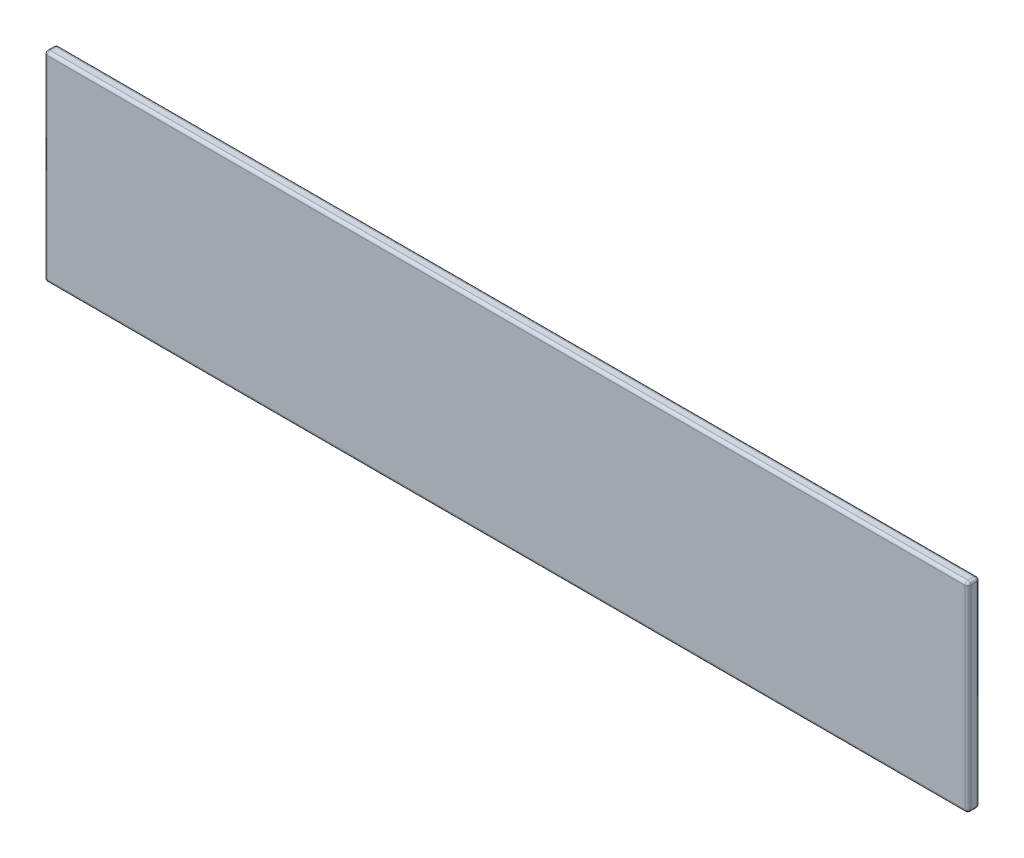
ISO-10303-21;
HEADER;
FILE_DESCRIPTION(('STEP AP214'),'2;1');
FILE_NAME('part.step','',(''),(''),'','','');
FILE_SCHEMA(('AUTOMOTIVE_DESIGN { 1 0 10303 214 1 1 1 1 }'));
ENDSEC;
DATA;
#1=APPLICATION_CONTEXT('core data for automotive mechanical design processes');
#2=APPLICATION_PROTOCOL_DEFINITION('international standard','automotive_design',2000,#1);
#3=PRODUCT_CONTEXT('',#1,'mechanical');
#4=PRODUCT('Part','Part','',(#3));
#5=PRODUCT_RELATED_PRODUCT_CATEGORY('part','',(#4));
#6=PRODUCT_DEFINITION_FORMATION('','',#4);
#7=PRODUCT_DEFINITION_CONTEXT('part definition',#1,'design');
#8=PRODUCT_DEFINITION('design','',#6,#7);
#9=PRODUCT_DEFINITION_SHAPE('','',#8);
#10=(LENGTH_UNIT() NAMED_UNIT(*) SI_UNIT(.MILLI.,.METRE.));
#11=(NAMED_UNIT(*) PLANE_ANGLE_UNIT() SI_UNIT($,.RADIAN.));
#12=(NAMED_UNIT(*) SI_UNIT($,.STERADIAN.) SOLID_ANGLE_UNIT());
#13=UNCERTAINTY_MEASURE_WITH_UNIT(LENGTH_MEASURE(1.E-05),#10,'distance_accuracy_value','');
#14=(GEOMETRIC_REPRESENTATION_CONTEXT(3) GLOBAL_UNCERTAINTY_ASSIGNED_CONTEXT((#13)) GLOBAL_UNIT_ASSIGNED_CONTEXT((#10,
#11,#12)) REPRESENTATION_CONTEXT('',''));
#15=CARTESIAN_POINT('',(0.,0.,0.));
#16=DIRECTION('',(0.,0.,1.));
#17=DIRECTION('',(1.,0.,0.));
#18=AXIS2_PLACEMENT_3D('',#15,#16,#17);
#19=CARTESIAN_POINT('',(77.35,-16.75,2.));
#20=DIRECTION('',(-1.,0.,0.));
#21=DIRECTION('',(0.,0.,1.));
#22=AXIS2_PLACEMENT_3D('',#19,#20,#21);
#23=PLANE('',#22);
#24=DIRECTION('',(0.,1.,0.));
#25=VECTOR('',#24,1.);
#26=CARTESIAN_POINT('',(77.35,-16.75,1.5));
#27=LINE('',#26,#25);
#28=CARTESIAN_POINT('',(77.35,16.25,1.5));
#29=VERTEX_POINT('',#28);
#30=CARTESIAN_POINT('',(77.35,-16.25,1.5));
#31=VERTEX_POINT('',#30);
#32=EDGE_CURVE('E42',#29,#31,#27,.F.);
#33=ORIENTED_EDGE('',*,*,#32,.T.);
#34=DIRECTION('',(0.,0.,-1.));
#35=VECTOR('',#34,1.);
#36=CARTESIAN_POINT('',(77.35,-16.25,2.));
#37=LINE('',#36,#35);
#38=CARTESIAN_POINT('',(77.35,-16.25,0.5));
#39=VERTEX_POINT('',#38);
#40=EDGE_CURVE('E11',#31,#39,#37,.T.);
#41=ORIENTED_EDGE('',*,*,#40,.T.);
#42=DIRECTION('',(0.,1.,0.));
#43=VECTOR('',#42,1.);
#44=CARTESIAN_POINT('',(77.35,16.75,0.5));
#45=LINE('',#44,#43);
#46=CARTESIAN_POINT('',(77.35,16.25,0.5));
#47=VERTEX_POINT('',#46);
#48=EDGE_CURVE('E194',#39,#47,#45,.T.);
#49=ORIENTED_EDGE('',*,*,#48,.T.);
#50=DIRECTION('',(0.,0.,-1.));
#51=VECTOR('',#50,1.);
#52=CARTESIAN_POINT('',(77.35,16.25,2.));
#53=LINE('',#52,#51);
#54=EDGE_CURVE('E53',#47,#29,#53,.F.);
#55=ORIENTED_EDGE('',*,*,#54,.T.);
#56=EDGE_LOOP('',(#33,#41,#49,#55));
#57=FACE_BOUND('',#56,.T.);
#58=ADVANCED_FACE('F33',(#57),#23,.F.);
#59=CARTESIAN_POINT('',(-77.35,16.75,2.));
#60=DIRECTION('',(0.,-1.,0.));
#61=DIRECTION('',(0.,0.,-1.));
#62=AXIS2_PLACEMENT_3D('',#59,#60,#61);
#63=PLANE('',#62);
#64=DIRECTION('',(0.,0.,-1.));
#65=VECTOR('',#64,1.);
#66=CARTESIAN_POINT('',(-76.85,16.75,2.));
#67=LINE('',#66,#65);
#68=CARTESIAN_POINT('',(-76.85,16.75,0.5));
#69=VERTEX_POINT('',#68);
#70=CARTESIAN_POINT('',(-76.85,16.75,1.5));
#71=VERTEX_POINT('',#70);
#72=EDGE_CURVE('E189',#69,#71,#67,.F.);
#73=ORIENTED_EDGE('',*,*,#72,.T.);
#74=DIRECTION('',(-1.,0.,0.));
#75=VECTOR('',#74,1.);
#76=CARTESIAN_POINT('',(-77.35,16.75,1.5));
#77=LINE('',#76,#75);
#78=CARTESIAN_POINT('',(76.85,16.75,1.5));
#79=VERTEX_POINT('',#78);
#80=EDGE_CURVE('E191',#71,#79,#77,.F.);
#81=ORIENTED_EDGE('',*,*,#80,.T.);
#82=DIRECTION('',(0.,0.,-1.));
#83=VECTOR('',#82,1.);
#84=CARTESIAN_POINT('',(76.85,16.75,2.));
#85=LINE('',#84,#83);
#86=CARTESIAN_POINT('',(76.85,16.75,0.5));
#87=VERTEX_POINT('',#86);
#88=EDGE_CURVE('E185',#79,#87,#85,.T.);
#89=ORIENTED_EDGE('',*,*,#88,.T.);
#90=DIRECTION('',(-1.,0.,0.));
#91=VECTOR('',#90,1.);
#92=CARTESIAN_POINT('',(-77.35,16.75,0.5));
#93=LINE('',#92,#91);
#94=EDGE_CURVE('E187',#87,#69,#93,.T.);
#95=ORIENTED_EDGE('',*,*,#94,.T.);
#96=EDGE_LOOP('',(#73,#81,#89,#95));
#97=FACE_BOUND('',#96,.T.);
#98=ADVANCED_FACE('F278',(#97),#63,.F.);
#99=CARTESIAN_POINT('',(-77.35,-16.75,2.));
#100=DIRECTION('',(1.,0.,0.));
#101=DIRECTION('',(0.,0.,-1.));
#102=AXIS2_PLACEMENT_3D('',#99,#100,#101);
#103=PLANE('',#102);
#104=DIRECTION('',(0.,0.,-1.));
#105=VECTOR('',#104,1.);
#106=CARTESIAN_POINT('',(-77.35,-16.25,2.));
#107=LINE('',#106,#105);
#108=CARTESIAN_POINT('',(-77.35,-16.25,0.5));
#109=VERTEX_POINT('',#108);
#110=CARTESIAN_POINT('',(-77.35,-16.25,1.5));
#111=VERTEX_POINT('',#110);
#112=EDGE_CURVE('E180',#109,#111,#107,.F.);
#113=ORIENTED_EDGE('',*,*,#112,.T.);
#114=DIRECTION('',(0.,-1.,0.));
#115=VECTOR('',#114,1.);
#116=CARTESIAN_POINT('',(-77.35,-16.75,1.5));
#117=LINE('',#116,#115);
#118=CARTESIAN_POINT('',(-77.35,16.25,1.5));
#119=VERTEX_POINT('',#118);
#120=EDGE_CURVE('E182',#111,#119,#117,.F.);
#121=ORIENTED_EDGE('',*,*,#120,.T.);
#122=DIRECTION('',(0.,0.,-1.));
#123=VECTOR('',#122,1.);
#124=CARTESIAN_POINT('',(-77.35,16.25,2.));
#125=LINE('',#124,#123);
#126=CARTESIAN_POINT('',(-77.35,16.25,0.5));
#127=VERTEX_POINT('',#126);
#128=EDGE_CURVE('E176',#119,#127,#125,.T.);
#129=ORIENTED_EDGE('',*,*,#128,.T.);
#130=DIRECTION('',(0.,-1.,0.));
#131=VECTOR('',#130,1.);
#132=CARTESIAN_POINT('',(-77.35,-16.75,0.5));
#133=LINE('',#132,#131);
#134=EDGE_CURVE('E178',#127,#109,#133,.T.);
#135=ORIENTED_EDGE('',*,*,#134,.T.);
#136=EDGE_LOOP('',(#113,#121,#129,#135));
#137=FACE_BOUND('',#136,.T.);
#138=ADVANCED_FACE('F269',(#137),#103,.F.);
#139=CARTESIAN_POINT('',(-77.35,-16.75,2.));
#140=DIRECTION('',(0.,1.,0.));
#141=DIRECTION('',(0.,0.,1.));
#142=AXIS2_PLACEMENT_3D('',#139,#140,#141);
#143=PLANE('',#142);
#144=DIRECTION('',(1.,0.,0.));
#145=VECTOR('',#144,1.);
#146=CARTESIAN_POINT('',(-77.35,-16.75,1.5));
#147=LINE('',#146,#145);
#148=CARTESIAN_POINT('',(76.85,-16.75,1.5));
#149=VERTEX_POINT('',#148);
#150=CARTESIAN_POINT('',(-76.85,-16.75,1.5));
#151=VERTEX_POINT('',#150);
#152=EDGE_CURVE('E129',#149,#151,#147,.F.);
#153=ORIENTED_EDGE('',*,*,#152,.T.);
#154=DIRECTION('',(0.,0.,-1.));
#155=VECTOR('',#154,1.);
#156=CARTESIAN_POINT('',(-76.85,-16.75,2.));
#157=LINE('',#156,#155);
#158=CARTESIAN_POINT('',(-76.85,-16.75,0.5));
#159=VERTEX_POINT('',#158);
#160=EDGE_CURVE('E165',#151,#159,#157,.T.);
#161=ORIENTED_EDGE('',*,*,#160,.T.);
#162=DIRECTION('',(1.,0.,0.));
#163=VECTOR('',#162,1.);
#164=CARTESIAN_POINT('',(77.35,-16.75,0.5));
#165=LINE('',#164,#163);
#166=CARTESIAN_POINT('',(76.85,-16.75,0.5));
#167=VERTEX_POINT('',#166);
#168=EDGE_CURVE('E158',#159,#167,#165,.T.);
#169=ORIENTED_EDGE('',*,*,#168,.T.);
#170=DIRECTION('',(0.,0.,-1.));
#171=VECTOR('',#170,1.);
#172=CARTESIAN_POINT('',(76.85,-16.75,2.));
#173=LINE('',#172,#171);
#174=EDGE_CURVE('E156',#167,#149,#173,.F.);
#175=ORIENTED_EDGE('',*,*,#174,.T.);
#176=EDGE_LOOP('',(#153,#161,#169,#175));
#177=FACE_BOUND('',#176,.T.);
#178=ADVANCED_FACE('F356',(#177),#143,.F.);
#179=CARTESIAN_POINT('',(0.,0.,2.));
#180=DIRECTION('',(0.,0.,-1.));
#181=DIRECTION('',(-1.,0.,0.));
#182=AXIS2_PLACEMENT_3D('',#179,#180,#181);
#183=PLANE('',#182);
#184=DIRECTION('',(0.,-1.,0.));
#185=VECTOR('',#184,1.);
#186=CARTESIAN_POINT('',(-76.85,0.,2.));
#187=LINE('',#186,#185);
#188=CARTESIAN_POINT('',(-76.85,16.25,2.));
#189=VERTEX_POINT('',#188);
#190=CARTESIAN_POINT('',(-76.85,-16.25,2.));
#191=VERTEX_POINT('',#190);
#192=EDGE_CURVE('E154',#189,#191,#187,.T.);
#193=ORIENTED_EDGE('',*,*,#192,.T.);
#194=DIRECTION('',(1.,0.,0.));
#195=VECTOR('',#194,1.);
#196=CARTESIAN_POINT('',(0.,-16.25,2.));
#197=LINE('',#196,#195);
#198=CARTESIAN_POINT('',(76.85,-16.25,2.));
#199=VERTEX_POINT('',#198);
#200=EDGE_CURVE('E127',#191,#199,#197,.T.);
#201=ORIENTED_EDGE('',*,*,#200,.T.);
#202=DIRECTION('',(0.,1.,0.));
#203=VECTOR('',#202,1.);
#204=CARTESIAN_POINT('',(76.85,0.,2.));
#205=LINE('',#204,#203);
#206=CARTESIAN_POINT('',(76.85,16.25,2.));
#207=VERTEX_POINT('',#206);
#208=EDGE_CURVE('E144',#199,#207,#205,.T.);
#209=ORIENTED_EDGE('',*,*,#208,.T.);
#210=DIRECTION('',(-1.,0.,0.));
#211=VECTOR('',#210,1.);
#212=CARTESIAN_POINT('',(0.,16.25,2.));
#213=LINE('',#212,#211);
#214=EDGE_CURVE('E150',#207,#189,#213,.T.);
#215=ORIENTED_EDGE('',*,*,#214,.T.);
#216=EDGE_LOOP('',(#193,#201,#209,#215));
#217=FACE_BOUND('',#216,.T.);
#218=ADVANCED_FACE('F152',(#217),#183,.F.);
#219=CARTESIAN_POINT('',(0.,0.,0.));
#220=DIRECTION('',(0.,0.,-1.));
#221=DIRECTION('',(-1.,0.,0.));
#222=AXIS2_PLACEMENT_3D('',#219,#220,#221);
#223=PLANE('',#222);
#224=DIRECTION('',(0.,1.,0.));
#225=VECTOR('',#224,1.);
#226=CARTESIAN_POINT('',(76.85,-16.75,0.));
#227=LINE('',#226,#225);
#228=CARTESIAN_POINT('',(76.85,16.25,0.));
#229=VERTEX_POINT('',#228);
#230=CARTESIAN_POINT('',(76.85,-16.25,0.));
#231=VERTEX_POINT('',#230);
#232=EDGE_CURVE('E167',#229,#231,#227,.F.);
#233=ORIENTED_EDGE('',*,*,#232,.T.);
#234=DIRECTION('',(1.,0.,0.));
#235=VECTOR('',#234,1.);
#236=CARTESIAN_POINT('',(-77.35,-16.25,0.));
#237=LINE('',#236,#235);
#238=CARTESIAN_POINT('',(-76.85,-16.25,0.));
#239=VERTEX_POINT('',#238);
#240=EDGE_CURVE('E173',#231,#239,#237,.F.);
#241=ORIENTED_EDGE('',*,*,#240,.T.);
#242=DIRECTION('',(0.,-1.,0.));
#243=VECTOR('',#242,1.);
#244=CARTESIAN_POINT('',(-76.85,16.75,0.));
#245=LINE('',#244,#243);
#246=CARTESIAN_POINT('',(-76.85,16.25,0.));
#247=VERTEX_POINT('',#246);
#248=EDGE_CURVE('E171',#239,#247,#245,.F.);
#249=ORIENTED_EDGE('',*,*,#248,.T.);
#250=DIRECTION('',(-1.,0.,0.));
#251=VECTOR('',#250,1.);
#252=CARTESIAN_POINT('',(77.35,16.25,0.));
#253=LINE('',#252,#251);
#254=EDGE_CURVE('E169',#247,#229,#253,.F.);
#255=ORIENTED_EDGE('',*,*,#254,.T.);
#256=EDGE_LOOP('',(#233,#241,#249,#255));
#257=FACE_BOUND('',#256,.T.);
#258=ADVANCED_FACE('F296',(#257),#223,.T.);
#259=CARTESIAN_POINT('',(-77.35,16.25,0.5));
#260=DIRECTION('',(1.,0.,0.));
#261=DIRECTION('',(0.,0.,-1.));
#262=AXIS2_PLACEMENT_3D('',#259,#260,#261);
#263=CYLINDRICAL_SURFACE('',#262,0.5);
#264=CARTESIAN_POINT('',(-76.85,16.25,0.5));
#265=DIRECTION('',(-1.,0.,0.));
#266=DIRECTION('',(0.,0.,1.));
#267=AXIS2_PLACEMENT_3D('',#264,#265,#266);
#268=CIRCLE('',#267,0.5);
#269=EDGE_CURVE('E37',#69,#247,#268,.T.);
#270=ORIENTED_EDGE('',*,*,#269,.F.);
#271=ORIENTED_EDGE('',*,*,#94,.F.);
#272=CARTESIAN_POINT('',(76.85,16.25,0.5));
#273=DIRECTION('',(1.,0.,0.));
#274=DIRECTION('',(0.,0.,-1.));
#275=AXIS2_PLACEMENT_3D('',#272,#273,#274);
#276=CIRCLE('',#275,0.5);
#277=EDGE_CURVE('E246',#229,#87,#276,.T.);
#278=ORIENTED_EDGE('',*,*,#277,.F.);
#279=ORIENTED_EDGE('',*,*,#254,.F.);
#280=EDGE_LOOP('',(#270,#271,#278,#279));
#281=FACE_BOUND('',#280,.T.);
#282=ADVANCED_FACE('F35',(#281),#263,.T.);
#283=CARTESIAN_POINT('',(-76.85,16.25,0.5));
#284=DIRECTION('',(0.,0.,1.));
#285=DIRECTION('',(1.,0.,0.));
#286=AXIS2_PLACEMENT_3D('',#283,#284,#285);
#287=SPHERICAL_SURFACE('',#286,0.5);
#288=CARTESIAN_POINT('',(-76.85,16.25,0.5));
#289=DIRECTION('',(0.,0.,-1.));
#290=DIRECTION('',(-1.,0.,0.));
#291=AXIS2_PLACEMENT_3D('',#288,#289,#290);
#292=CIRCLE('',#291,0.5);
#293=EDGE_CURVE('E241',#69,#127,#292,.F.);
#294=ORIENTED_EDGE('',*,*,#293,.F.);
#295=ORIENTED_EDGE('',*,*,#269,.T.);
#296=CARTESIAN_POINT('',(-76.85,16.25,0.5));
#297=DIRECTION('',(0.,1.,0.));
#298=DIRECTION('',(0.,0.,1.));
#299=AXIS2_PLACEMENT_3D('',#296,#297,#298);
#300=CIRCLE('',#299,0.5);
#301=EDGE_CURVE('E244',#127,#247,#300,.F.);
#302=ORIENTED_EDGE('',*,*,#301,.F.);
#303=EDGE_LOOP('',(#294,#295,#302));
#304=FACE_BOUND('',#303,.T.);
#305=ADVANCED_FACE('F257',(#304),#287,.T.);
#306=CARTESIAN_POINT('',(76.85,16.25,0.5));
#307=DIRECTION('',(0.,0.,1.));
#308=DIRECTION('',(1.,0.,0.));
#309=AXIS2_PLACEMENT_3D('',#306,#307,#308);
#310=SPHERICAL_SURFACE('',#309,0.5);
#311=CARTESIAN_POINT('',(76.85,16.25,0.5));
#312=DIRECTION('',(0.,1.,0.));
#313=DIRECTION('',(0.,0.,1.));
#314=AXIS2_PLACEMENT_3D('',#311,#312,#313);
#315=CIRCLE('',#314,0.5);
#316=EDGE_CURVE('E235',#229,#47,#315,.F.);
#317=ORIENTED_EDGE('',*,*,#316,.F.);
#318=ORIENTED_EDGE('',*,*,#277,.T.);
#319=CARTESIAN_POINT('',(76.85,16.25,0.5));
#320=DIRECTION('',(0.,0.,-1.));
#321=DIRECTION('',(-1.,0.,0.));
#322=AXIS2_PLACEMENT_3D('',#319,#320,#321);
#323=CIRCLE('',#322,0.5);
#324=EDGE_CURVE('E238',#47,#87,#323,.F.);
#325=ORIENTED_EDGE('',*,*,#324,.F.);
#326=EDGE_LOOP('',(#317,#318,#325));
#327=FACE_BOUND('',#326,.T.);
#328=ADVANCED_FACE('F289',(#327),#310,.T.);
#329=CARTESIAN_POINT('',(-76.85,-16.75,0.5));
#330=DIRECTION('',(0.,1.,0.));
#331=DIRECTION('',(0.,0.,1.));
#332=AXIS2_PLACEMENT_3D('',#329,#330,#331);
#333=CYLINDRICAL_SURFACE('',#332,0.5);
#334=ORIENTED_EDGE('',*,*,#301,.T.);
#335=ORIENTED_EDGE('',*,*,#248,.F.);
#336=CARTESIAN_POINT('',(-76.85,-16.25,0.5));
#337=DIRECTION('',(0.,-1.,0.));
#338=DIRECTION('',(0.,0.,-1.));
#339=AXIS2_PLACEMENT_3D('',#336,#337,#338);
#340=CIRCLE('',#339,0.5);
#341=EDGE_CURVE('E230',#109,#239,#340,.T.);
#342=ORIENTED_EDGE('',*,*,#341,.F.);
#343=ORIENTED_EDGE('',*,*,#134,.F.);
#344=EDGE_LOOP('',(#334,#335,#342,#343));
#345=FACE_BOUND('',#344,.T.);
#346=ADVANCED_FACE('F265',(#345),#333,.T.);
#347=CARTESIAN_POINT('',(-76.85,16.25,2.));
#348=DIRECTION('',(0.,0.,-1.));
#349=DIRECTION('',(-1.,0.,0.));
#350=AXIS2_PLACEMENT_3D('',#347,#348,#349);
#351=CYLINDRICAL_SURFACE('',#350,0.5);
#352=ORIENTED_EDGE('',*,*,#293,.T.);
#353=ORIENTED_EDGE('',*,*,#128,.F.);
#354=CARTESIAN_POINT('',(-76.85,16.25,1.5));
#355=DIRECTION('',(0.,0.,1.));
#356=DIRECTION('',(1.,0.,0.));
#357=AXIS2_PLACEMENT_3D('',#354,#355,#356);
#358=CIRCLE('',#357,0.5);
#359=EDGE_CURVE('E227',#71,#119,#358,.T.);
#360=ORIENTED_EDGE('',*,*,#359,.F.);
#361=ORIENTED_EDGE('',*,*,#72,.F.);
#362=EDGE_LOOP('',(#352,#353,#360,#361));
#363=FACE_BOUND('',#362,.T.);
#364=ADVANCED_FACE('F275',(#363),#351,.T.);
#365=CARTESIAN_POINT('',(0.,16.25,1.5));
#366=DIRECTION('',(-1.,0.,0.));
#367=DIRECTION('',(0.,0.,1.));
#368=AXIS2_PLACEMENT_3D('',#365,#366,#367);
#369=CYLINDRICAL_SURFACE('',#368,0.5);
#370=CARTESIAN_POINT('',(76.85,16.25,1.5));
#371=DIRECTION('',(1.,0.,0.));
#372=DIRECTION('',(0.,0.,-1.));
#373=AXIS2_PLACEMENT_3D('',#370,#371,#372);
#374=CIRCLE('',#373,0.5);
#375=EDGE_CURVE('E221',#79,#207,#374,.T.);
#376=ORIENTED_EDGE('',*,*,#375,.F.);
#377=ORIENTED_EDGE('',*,*,#80,.F.);
#378=CARTESIAN_POINT('',(-76.85,16.25,1.5));
#379=DIRECTION('',(-1.,0.,0.));
#380=DIRECTION('',(0.,0.,1.));
#381=AXIS2_PLACEMENT_3D('',#378,#379,#380);
#382=CIRCLE('',#381,0.5);
#383=EDGE_CURVE('E224',#189,#71,#382,.T.);
#384=ORIENTED_EDGE('',*,*,#383,.F.);
#385=ORIENTED_EDGE('',*,*,#214,.F.);
#386=EDGE_LOOP('',(#376,#377,#384,#385));
#387=FACE_BOUND('',#386,.T.);
#388=ADVANCED_FACE('F282',(#387),#369,.T.);
#389=CARTESIAN_POINT('',(76.85,16.25,2.));
#390=DIRECTION('',(0.,0.,-1.));
#391=DIRECTION('',(-1.,0.,0.));
#392=AXIS2_PLACEMENT_3D('',#389,#390,#391);
#393=CYLINDRICAL_SURFACE('',#392,0.5);
#394=ORIENTED_EDGE('',*,*,#324,.T.);
#395=ORIENTED_EDGE('',*,*,#88,.F.);
#396=CARTESIAN_POINT('',(76.85,16.25,1.5));
#397=DIRECTION('',(0.,0.,1.));
#398=DIRECTION('',(1.,0.,0.));
#399=AXIS2_PLACEMENT_3D('',#396,#397,#398);
#400=CIRCLE('',#399,0.5);
#401=EDGE_CURVE('E219',#29,#79,#400,.T.);
#402=ORIENTED_EDGE('',*,*,#401,.F.);
#403=ORIENTED_EDGE('',*,*,#54,.F.);
#404=EDGE_LOOP('',(#394,#395,#402,#403));
#405=FACE_BOUND('',#404,.T.);
#406=ADVANCED_FACE('F287',(#405),#393,.T.);
#407=CARTESIAN_POINT('',(76.85,-16.75,0.5));
#408=DIRECTION('',(0.,-1.,0.));
#409=DIRECTION('',(0.,0.,-1.));
#410=AXIS2_PLACEMENT_3D('',#407,#408,#409);
#411=CYLINDRICAL_SURFACE('',#410,0.5);
#412=ORIENTED_EDGE('',*,*,#316,.T.);
#413=ORIENTED_EDGE('',*,*,#48,.F.);
#414=CARTESIAN_POINT('',(76.85,-16.25,0.5));
#415=DIRECTION('',(0.,-1.,0.));
#416=DIRECTION('',(0.,0.,-1.));
#417=AXIS2_PLACEMENT_3D('',#414,#415,#416);
#418=CIRCLE('',#417,0.5);
#419=EDGE_CURVE('E216',#231,#39,#418,.T.);
#420=ORIENTED_EDGE('',*,*,#419,.F.);
#421=ORIENTED_EDGE('',*,*,#232,.F.);
#422=EDGE_LOOP('',(#412,#413,#420,#421));
#423=FACE_BOUND('',#422,.T.);
#424=ADVANCED_FACE('F293',(#423),#411,.T.);
#425=CARTESIAN_POINT('',(-77.35,-16.25,0.5));
#426=DIRECTION('',(-1.,0.,0.));
#427=DIRECTION('',(0.,0.,1.));
#428=AXIS2_PLACEMENT_3D('',#425,#426,#427);
#429=CYLINDRICAL_SURFACE('',#428,0.5);
#430=CARTESIAN_POINT('',(-76.85,-16.25,0.5));
#431=DIRECTION('',(-1.,0.,0.));
#432=DIRECTION('',(0.,0.,1.));
#433=AXIS2_PLACEMENT_3D('',#430,#431,#432);
#434=CIRCLE('',#433,0.5);
#435=EDGE_CURVE('E232',#239,#159,#434,.T.);
#436=ORIENTED_EDGE('',*,*,#435,.F.);
#437=ORIENTED_EDGE('',*,*,#240,.F.);
#438=CARTESIAN_POINT('',(76.85,-16.25,0.5));
#439=DIRECTION('',(1.,0.,0.));
#440=DIRECTION('',(0.,0.,-1.));
#441=AXIS2_PLACEMENT_3D('',#438,#439,#440);
#442=CIRCLE('',#441,0.5);
#443=EDGE_CURVE('E213',#167,#231,#442,.T.);
#444=ORIENTED_EDGE('',*,*,#443,.F.);
#445=ORIENTED_EDGE('',*,*,#168,.F.);
#446=EDGE_LOOP('',(#436,#437,#444,#445));
#447=FACE_BOUND('',#446,.T.);
#448=ADVANCED_FACE('F300',(#447),#429,.T.);
#449=CARTESIAN_POINT('',(-76.85,-16.25,0.5));
#450=DIRECTION('',(0.,0.,1.));
#451=DIRECTION('',(1.,0.,0.));
#452=AXIS2_PLACEMENT_3D('',#449,#450,#451);
#453=SPHERICAL_SURFACE('',#452,0.5);
#454=ORIENTED_EDGE('',*,*,#341,.T.);
#455=ORIENTED_EDGE('',*,*,#435,.T.);
#456=CARTESIAN_POINT('',(-76.85,-16.25,0.5));
#457=DIRECTION('',(0.,0.,-1.));
#458=DIRECTION('',(-1.,0.,0.));
#459=AXIS2_PLACEMENT_3D('',#456,#457,#458);
#460=CIRCLE('',#459,0.5);
#461=EDGE_CURVE('E210',#109,#159,#460,.F.);
#462=ORIENTED_EDGE('',*,*,#461,.F.);
#463=EDGE_LOOP('',(#454,#455,#462));
#464=FACE_BOUND('',#463,.T.);
#465=ADVANCED_FACE('F304',(#464),#453,.T.);
#466=CARTESIAN_POINT('',(-76.85,16.25,1.5));
#467=DIRECTION('',(0.,0.,1.));
#468=DIRECTION('',(1.,0.,0.));
#469=AXIS2_PLACEMENT_3D('',#466,#467,#468);
#470=SPHERICAL_SURFACE('',#469,0.5);
#471=ORIENTED_EDGE('',*,*,#383,.T.);
#472=ORIENTED_EDGE('',*,*,#359,.T.);
#473=CARTESIAN_POINT('',(-76.85,16.25,1.5));
#474=DIRECTION('',(0.,1.,0.));
#475=DIRECTION('',(0.,0.,1.));
#476=AXIS2_PLACEMENT_3D('',#473,#474,#475);
#477=CIRCLE('',#476,0.5);
#478=EDGE_CURVE('E208',#189,#119,#477,.F.);
#479=ORIENTED_EDGE('',*,*,#478,.F.);
#480=EDGE_LOOP('',(#471,#472,#479));
#481=FACE_BOUND('',#480,.T.);
#482=ADVANCED_FACE('F315',(#481),#470,.T.);
#483=CARTESIAN_POINT('',(76.85,16.25,1.5));
#484=DIRECTION('',(0.,0.,1.));
#485=DIRECTION('',(1.,0.,0.));
#486=AXIS2_PLACEMENT_3D('',#483,#484,#485);
#487=SPHERICAL_SURFACE('',#486,0.5);
#488=ORIENTED_EDGE('',*,*,#401,.T.);
#489=ORIENTED_EDGE('',*,*,#375,.T.);
#490=CARTESIAN_POINT('',(76.85,16.25,1.5));
#491=DIRECTION('',(0.,1.,0.));
#492=DIRECTION('',(0.,0.,1.));
#493=AXIS2_PLACEMENT_3D('',#490,#491,#492);
#494=CIRCLE('',#493,0.5);
#495=EDGE_CURVE('E147',#29,#207,#494,.F.);
#496=ORIENTED_EDGE('',*,*,#495,.F.);
#497=EDGE_LOOP('',(#488,#489,#496));
#498=FACE_BOUND('',#497,.T.);
#499=ADVANCED_FACE('F317',(#498),#487,.T.);
#500=CARTESIAN_POINT('',(76.85,-16.25,0.5));
#501=DIRECTION('',(0.,0.,1.));
#502=DIRECTION('',(1.,0.,0.));
#503=AXIS2_PLACEMENT_3D('',#500,#501,#502);
#504=SPHERICAL_SURFACE('',#503,0.5);
#505=ORIENTED_EDGE('',*,*,#443,.T.);
#506=ORIENTED_EDGE('',*,*,#419,.T.);
#507=CARTESIAN_POINT('',(76.85,-16.25,0.5));
#508=DIRECTION('',(0.,0.,-1.));
#509=DIRECTION('',(-1.,0.,0.));
#510=AXIS2_PLACEMENT_3D('',#507,#508,#509);
#511=CIRCLE('',#510,0.5);
#512=EDGE_CURVE('E205',#167,#39,#511,.F.);
#513=ORIENTED_EDGE('',*,*,#512,.F.);
#514=EDGE_LOOP('',(#505,#506,#513));
#515=FACE_BOUND('',#514,.T.);
#516=ADVANCED_FACE('F323',(#515),#504,.T.);
#517=CARTESIAN_POINT('',(-76.85,-16.25,2.));
#518=DIRECTION('',(0.,0.,-1.));
#519=DIRECTION('',(-1.,0.,0.));
#520=AXIS2_PLACEMENT_3D('',#517,#518,#519);
#521=CYLINDRICAL_SURFACE('',#520,0.5);
#522=ORIENTED_EDGE('',*,*,#461,.T.);
#523=ORIENTED_EDGE('',*,*,#160,.F.);
#524=CARTESIAN_POINT('',(-76.85,-16.25,1.5));
#525=DIRECTION('',(0.,0.,1.));
#526=DIRECTION('',(1.,0.,0.));
#527=AXIS2_PLACEMENT_3D('',#524,#525,#526);
#528=CIRCLE('',#527,0.5);
#529=EDGE_CURVE('E202',#111,#151,#528,.T.);
#530=ORIENTED_EDGE('',*,*,#529,.F.);
#531=ORIENTED_EDGE('',*,*,#112,.F.);
#532=EDGE_LOOP('',(#522,#523,#530,#531));
#533=FACE_BOUND('',#532,.T.);
#534=ADVANCED_FACE('F307',(#533),#521,.T.);
#535=CARTESIAN_POINT('',(-76.85,0.,1.5));
#536=DIRECTION('',(0.,-1.,0.));
#537=DIRECTION('',(0.,0.,-1.));
#538=AXIS2_PLACEMENT_3D('',#535,#536,#537);
#539=CYLINDRICAL_SURFACE('',#538,0.5);
#540=ORIENTED_EDGE('',*,*,#478,.T.);
#541=ORIENTED_EDGE('',*,*,#120,.F.);
#542=CARTESIAN_POINT('',(-76.85,-16.25,1.5));
#543=DIRECTION('',(0.,-1.,0.));
#544=DIRECTION('',(0.,0.,-1.));
#545=AXIS2_PLACEMENT_3D('',#542,#543,#544);
#546=CIRCLE('',#545,0.5);
#547=EDGE_CURVE('E141',#191,#111,#546,.T.);
#548=ORIENTED_EDGE('',*,*,#547,.F.);
#549=ORIENTED_EDGE('',*,*,#192,.F.);
#550=EDGE_LOOP('',(#540,#541,#548,#549));
#551=FACE_BOUND('',#550,.T.);
#552=ADVANCED_FACE('F313',(#551),#539,.T.);
#553=CARTESIAN_POINT('',(76.85,0.,1.5));
#554=DIRECTION('',(0.,1.,0.));
#555=DIRECTION('',(0.,0.,1.));
#556=AXIS2_PLACEMENT_3D('',#553,#554,#555);
#557=CYLINDRICAL_SURFACE('',#556,0.5);
#558=ORIENTED_EDGE('',*,*,#495,.T.);
#559=ORIENTED_EDGE('',*,*,#208,.F.);
#560=CARTESIAN_POINT('',(76.85,-16.25,1.5));
#561=DIRECTION('',(0.,-1.,0.));
#562=DIRECTION('',(0.,0.,-1.));
#563=AXIS2_PLACEMENT_3D('',#560,#561,#562);
#564=CIRCLE('',#563,0.5);
#565=EDGE_CURVE('E135',#31,#199,#564,.T.);
#566=ORIENTED_EDGE('',*,*,#565,.F.);
#567=ORIENTED_EDGE('',*,*,#32,.F.);
#568=EDGE_LOOP('',(#558,#559,#566,#567));
#569=FACE_BOUND('',#568,.T.);
#570=ADVANCED_FACE('F145',(#569),#557,.T.);
#571=CARTESIAN_POINT('',(76.85,-16.25,2.));
#572=DIRECTION('',(0.,0.,-1.));
#573=DIRECTION('',(-1.,0.,0.));
#574=AXIS2_PLACEMENT_3D('',#571,#572,#573);
#575=CYLINDRICAL_SURFACE('',#574,0.5);
#576=ORIENTED_EDGE('',*,*,#512,.T.);
#577=ORIENTED_EDGE('',*,*,#40,.F.);
#578=CARTESIAN_POINT('',(76.85,-16.25,1.5));
#579=DIRECTION('',(0.,0.,1.));
#580=DIRECTION('',(1.,0.,0.));
#581=AXIS2_PLACEMENT_3D('',#578,#579,#580);
#582=CIRCLE('',#581,0.5);
#583=EDGE_CURVE('E139',#149,#31,#582,.T.);
#584=ORIENTED_EDGE('',*,*,#583,.F.);
#585=ORIENTED_EDGE('',*,*,#174,.F.);
#586=EDGE_LOOP('',(#576,#577,#584,#585));
#587=FACE_BOUND('',#586,.T.);
#588=ADVANCED_FACE('F340',(#587),#575,.T.);
#589=CARTESIAN_POINT('',(-76.85,-16.25,1.5));
#590=DIRECTION('',(0.,0.,1.));
#591=DIRECTION('',(1.,0.,0.));
#592=AXIS2_PLACEMENT_3D('',#589,#590,#591);
#593=SPHERICAL_SURFACE('',#592,0.5);
#594=ORIENTED_EDGE('',*,*,#547,.T.);
#595=ORIENTED_EDGE('',*,*,#529,.T.);
#596=CARTESIAN_POINT('',(-76.85,-16.25,1.5));
#597=DIRECTION('',(-1.,0.,0.));
#598=DIRECTION('',(0.,0.,1.));
#599=AXIS2_PLACEMENT_3D('',#596,#597,#598);
#600=CIRCLE('',#599,0.5);
#601=EDGE_CURVE('E132',#191,#151,#600,.F.);
#602=ORIENTED_EDGE('',*,*,#601,.F.);
#603=EDGE_LOOP('',(#594,#595,#602));
#604=FACE_BOUND('',#603,.T.);
#605=ADVANCED_FACE('F311',(#604),#593,.T.);
#606=CARTESIAN_POINT('',(76.85,-16.25,1.5));
#607=DIRECTION('',(0.,0.,1.));
#608=DIRECTION('',(1.,0.,0.));
#609=AXIS2_PLACEMENT_3D('',#606,#607,#608);
#610=SPHERICAL_SURFACE('',#609,0.5);
#611=ORIENTED_EDGE('',*,*,#583,.T.);
#612=ORIENTED_EDGE('',*,*,#565,.T.);
#613=CARTESIAN_POINT('',(76.85,-16.25,1.5));
#614=DIRECTION('',(1.,0.,0.));
#615=DIRECTION('',(0.,0.,-1.));
#616=AXIS2_PLACEMENT_3D('',#613,#614,#615);
#617=CIRCLE('',#616,0.5);
#618=EDGE_CURVE('E123',#149,#199,#617,.F.);
#619=ORIENTED_EDGE('',*,*,#618,.F.);
#620=EDGE_LOOP('',(#611,#612,#619));
#621=FACE_BOUND('',#620,.T.);
#622=ADVANCED_FACE('F137',(#621),#610,.T.);
#623=CARTESIAN_POINT('',(0.,-16.25,1.5));
#624=DIRECTION('',(1.,0.,0.));
#625=DIRECTION('',(0.,0.,-1.));
#626=AXIS2_PLACEMENT_3D('',#623,#624,#625);
#627=CYLINDRICAL_SURFACE('',#626,0.5);
#628=ORIENTED_EDGE('',*,*,#601,.T.);
#629=ORIENTED_EDGE('',*,*,#152,.F.);
#630=ORIENTED_EDGE('',*,*,#618,.T.);
#631=ORIENTED_EDGE('',*,*,#200,.F.);
#632=EDGE_LOOP('',(#628,#629,#630,#631));
#633=FACE_BOUND('',#632,.T.);
#634=ADVANCED_FACE('F125',(#633),#627,.T.);
#635=CLOSED_SHELL('',(#58,#98,#138,#178,#218,#258,#282,#305,#328,#346,#364,#388,#406,#424,#448,
#465,#482,#499,#516,#534,#552,#570,#588,#605,#622,#634));
#636=MANIFOLD_SOLID_BREP('B2',#635);
#637=ADVANCED_BREP_SHAPE_REPRESENTATION('',(#18,#636),#14);
#638=SHAPE_DEFINITION_REPRESENTATION(#9,#637);
ENDSEC;
END-ISO-10303-21;
